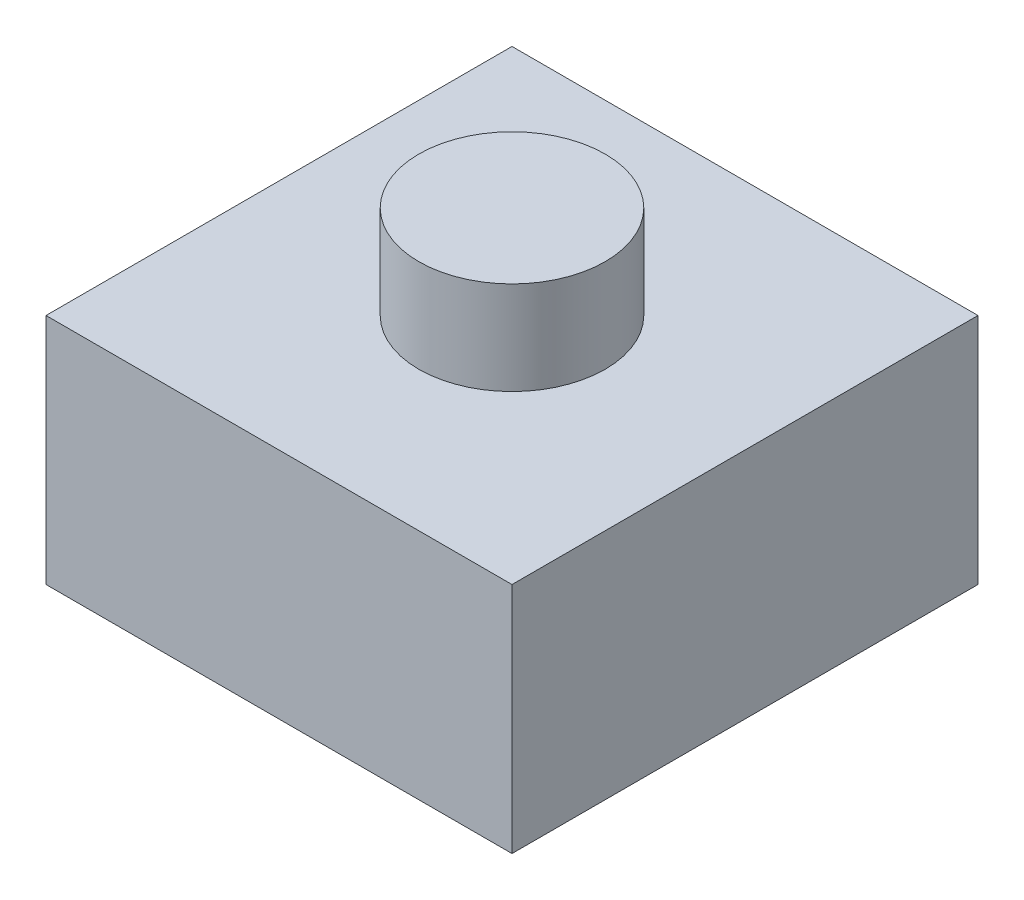
ISO-10303-21;
HEADER;
FILE_DESCRIPTION(('STEP AP214'),'2;1');
FILE_NAME('part.step','',(''),(''),'','','');
FILE_SCHEMA(('AUTOMOTIVE_DESIGN { 1 0 10303 214 1 1 1 1 }'));
ENDSEC;
DATA;
#1=APPLICATION_CONTEXT('core data for automotive mechanical design processes');
#2=APPLICATION_PROTOCOL_DEFINITION('international standard','automotive_design',2000,#1);
#3=PRODUCT_CONTEXT('',#1,'mechanical');
#4=PRODUCT('Part','Part','',(#3));
#5=PRODUCT_RELATED_PRODUCT_CATEGORY('part','',(#4));
#6=PRODUCT_DEFINITION_FORMATION('','',#4);
#7=PRODUCT_DEFINITION_CONTEXT('part definition',#1,'design');
#8=PRODUCT_DEFINITION('design','',#6,#7);
#9=PRODUCT_DEFINITION_SHAPE('','',#8);
#10=(LENGTH_UNIT() NAMED_UNIT(*) SI_UNIT(.MILLI.,.METRE.));
#11=(NAMED_UNIT(*) PLANE_ANGLE_UNIT() SI_UNIT($,.RADIAN.));
#12=(NAMED_UNIT(*) SI_UNIT($,.STERADIAN.) SOLID_ANGLE_UNIT());
#13=UNCERTAINTY_MEASURE_WITH_UNIT(LENGTH_MEASURE(1.E-05),#10,'distance_accuracy_value','');
#14=(GEOMETRIC_REPRESENTATION_CONTEXT(3) GLOBAL_UNCERTAINTY_ASSIGNED_CONTEXT((#13)) GLOBAL_UNIT_ASSIGNED_CONTEXT((#10,
#11,#12)) REPRESENTATION_CONTEXT('',''));
#15=CARTESIAN_POINT('',(0.,0.,0.));
#16=DIRECTION('',(0.,0.,1.));
#17=DIRECTION('',(1.,0.,0.));
#18=AXIS2_PLACEMENT_3D('',#15,#16,#17);
#19=CARTESIAN_POINT('',(-2.5,2.5,2.5));
#20=DIRECTION('',(1.,0.,0.));
#21=DIRECTION('',(0.,0.,-1.));
#22=AXIS2_PLACEMENT_3D('',#19,#20,#21);
#23=PLANE('',#22);
#24=DIRECTION('',(0.,0.,1.));
#25=VECTOR('',#24,1.);
#26=CARTESIAN_POINT('',(-2.5,0.,2.5));
#27=LINE('',#26,#25);
#28=CARTESIAN_POINT('',(-2.5,0.,-2.5));
#29=VERTEX_POINT('',#28);
#30=CARTESIAN_POINT('',(-2.5,0.,2.5));
#31=VERTEX_POINT('',#30);
#32=EDGE_CURVE('E99',#29,#31,#27,.T.);
#33=ORIENTED_EDGE('',*,*,#32,.T.);
#34=DIRECTION('',(0.,-1.,0.));
#35=VECTOR('',#34,1.);
#36=CARTESIAN_POINT('',(-2.5,2.5,2.5));
#37=LINE('',#36,#35);
#38=CARTESIAN_POINT('',(-2.5,2.5,2.5));
#39=VERTEX_POINT('',#38);
#40=EDGE_CURVE('E36',#39,#31,#37,.T.);
#41=ORIENTED_EDGE('',*,*,#40,.F.);
#42=DIRECTION('',(0.,0.,1.));
#43=VECTOR('',#42,1.);
#44=CARTESIAN_POINT('',(-2.5,2.5,2.5));
#45=LINE('',#44,#43);
#46=CARTESIAN_POINT('',(-2.5,2.5,-2.5));
#47=VERTEX_POINT('',#46);
#48=EDGE_CURVE('E86',#47,#39,#45,.T.);
#49=ORIENTED_EDGE('',*,*,#48,.F.);
#50=DIRECTION('',(0.,-1.,0.));
#51=VECTOR('',#50,1.);
#52=CARTESIAN_POINT('',(-2.5,2.5,-2.5));
#53=LINE('',#52,#51);
#54=EDGE_CURVE('E95',#47,#29,#53,.T.);
#55=ORIENTED_EDGE('',*,*,#54,.T.);
#56=EDGE_LOOP('',(#33,#41,#49,#55));
#57=FACE_BOUND('',#56,.T.);
#58=ADVANCED_FACE('F33',(#57),#23,.F.);
#59=CARTESIAN_POINT('',(2.5,2.5,2.5));
#60=DIRECTION('',(0.,0.,-1.));
#61=DIRECTION('',(-1.,0.,0.));
#62=AXIS2_PLACEMENT_3D('',#59,#60,#61);
#63=PLANE('',#62);
#64=DIRECTION('',(1.,0.,0.));
#65=VECTOR('',#64,1.);
#66=CARTESIAN_POINT('',(2.5,0.,2.5));
#67=LINE('',#66,#65);
#68=CARTESIAN_POINT('',(2.5,0.,2.5));
#69=VERTEX_POINT('',#68);
#70=EDGE_CURVE('E91',#31,#69,#67,.T.);
#71=ORIENTED_EDGE('',*,*,#70,.T.);
#72=DIRECTION('',(0.,-1.,0.));
#73=VECTOR('',#72,1.);
#74=CARTESIAN_POINT('',(2.5,2.5,2.5));
#75=LINE('',#74,#73);
#76=CARTESIAN_POINT('',(2.5,2.5,2.5));
#77=VERTEX_POINT('',#76);
#78=EDGE_CURVE('E89',#77,#69,#75,.T.);
#79=ORIENTED_EDGE('',*,*,#78,.F.);
#80=DIRECTION('',(1.,0.,0.));
#81=VECTOR('',#80,1.);
#82=CARTESIAN_POINT('',(2.5,2.5,2.5));
#83=LINE('',#82,#81);
#84=EDGE_CURVE('E81',#39,#77,#83,.T.);
#85=ORIENTED_EDGE('',*,*,#84,.F.);
#86=ORIENTED_EDGE('',*,*,#40,.T.);
#87=EDGE_LOOP('',(#71,#79,#85,#86));
#88=FACE_BOUND('',#87,.T.);
#89=ADVANCED_FACE('F90',(#88),#63,.F.);
#90=CARTESIAN_POINT('',(2.5,2.5,2.5));
#91=DIRECTION('',(-1.,0.,0.));
#92=DIRECTION('',(0.,0.,1.));
#93=AXIS2_PLACEMENT_3D('',#90,#91,#92);
#94=PLANE('',#93);
#95=DIRECTION('',(0.,0.,-1.));
#96=VECTOR('',#95,1.);
#97=CARTESIAN_POINT('',(2.5,0.,2.5));
#98=LINE('',#97,#96);
#99=CARTESIAN_POINT('',(2.5,0.,-2.5));
#100=VERTEX_POINT('',#99);
#101=EDGE_CURVE('E67',#69,#100,#98,.T.);
#102=ORIENTED_EDGE('',*,*,#101,.T.);
#103=DIRECTION('',(0.,-1.,0.));
#104=VECTOR('',#103,1.);
#105=CARTESIAN_POINT('',(2.5,2.5,-2.5));
#106=LINE('',#105,#104);
#107=CARTESIAN_POINT('',(2.5,2.5,-2.5));
#108=VERTEX_POINT('',#107);
#109=EDGE_CURVE('E92',#108,#100,#106,.T.);
#110=ORIENTED_EDGE('',*,*,#109,.F.);
#111=DIRECTION('',(0.,0.,-1.));
#112=VECTOR('',#111,1.);
#113=CARTESIAN_POINT('',(2.5,2.5,2.5));
#114=LINE('',#113,#112);
#115=EDGE_CURVE('E84',#77,#108,#114,.T.);
#116=ORIENTED_EDGE('',*,*,#115,.F.);
#117=ORIENTED_EDGE('',*,*,#78,.T.);
#118=EDGE_LOOP('',(#102,#110,#116,#117));
#119=FACE_BOUND('',#118,.T.);
#120=ADVANCED_FACE('F93',(#119),#94,.F.);
#121=CARTESIAN_POINT('',(2.5,2.5,-2.5));
#122=DIRECTION('',(0.,0.,1.));
#123=DIRECTION('',(1.,0.,0.));
#124=AXIS2_PLACEMENT_3D('',#121,#122,#123);
#125=PLANE('',#124);
#126=DIRECTION('',(-1.,0.,0.));
#127=VECTOR('',#126,1.);
#128=CARTESIAN_POINT('',(2.5,0.,-2.5));
#129=LINE('',#128,#127);
#130=EDGE_CURVE('E73',#100,#29,#129,.T.);
#131=ORIENTED_EDGE('',*,*,#130,.T.);
#132=ORIENTED_EDGE('',*,*,#54,.F.);
#133=DIRECTION('',(-1.,0.,0.));
#134=VECTOR('',#133,1.);
#135=CARTESIAN_POINT('',(2.5,2.5,-2.5));
#136=LINE('',#135,#134);
#137=EDGE_CURVE('E50',#108,#47,#136,.T.);
#138=ORIENTED_EDGE('',*,*,#137,.F.);
#139=ORIENTED_EDGE('',*,*,#109,.T.);
#140=EDGE_LOOP('',(#131,#132,#138,#139));
#141=FACE_BOUND('',#140,.T.);
#142=ADVANCED_FACE('F107',(#141),#125,.F.);
#143=CARTESIAN_POINT('',(0.,2.5,0.));
#144=DIRECTION('',(0.,1.,0.));
#145=DIRECTION('',(0.,0.,1.));
#146=AXIS2_PLACEMENT_3D('',#143,#144,#145);
#147=PLANE('',#146);
#148=CARTESIAN_POINT('',(0.,2.5,0.));
#149=DIRECTION('',(0.,1.,0.));
#150=DIRECTION('',(0.,0.,1.));
#151=AXIS2_PLACEMENT_3D('',#148,#149,#150);
#152=CIRCLE('',#151,1.);
#153=CARTESIAN_POINT('',(0.,2.5,1.));
#154=VERTEX_POINT('',#153);
#155=EDGE_CURVE('E11',#154,#154,#152,.T.);
#156=ORIENTED_EDGE('',*,*,#155,.F.);
#157=EDGE_LOOP('',(#156));
#158=FACE_BOUND('',#157,.T.);
#159=ORIENTED_EDGE('',*,*,#48,.T.);
#160=ORIENTED_EDGE('',*,*,#84,.T.);
#161=ORIENTED_EDGE('',*,*,#115,.T.);
#162=ORIENTED_EDGE('',*,*,#137,.T.);
#163=EDGE_LOOP('',(#159,#160,#161,#162));
#164=FACE_BOUND('',#163,.T.);
#165=ADVANCED_FACE('F82',(#158,#164),#147,.T.);
#166=CARTESIAN_POINT('',(0.,0.,0.));
#167=DIRECTION('',(0.,1.,0.));
#168=DIRECTION('',(0.,0.,1.));
#169=AXIS2_PLACEMENT_3D('',#166,#167,#168);
#170=PLANE('',#169);
#171=ORIENTED_EDGE('',*,*,#32,.F.);
#172=ORIENTED_EDGE('',*,*,#130,.F.);
#173=ORIENTED_EDGE('',*,*,#101,.F.);
#174=ORIENTED_EDGE('',*,*,#70,.F.);
#175=EDGE_LOOP('',(#171,#172,#173,#174));
#176=FACE_BOUND('',#175,.T.);
#177=ADVANCED_FACE('F110',(#176),#170,.F.);
#178=CARTESIAN_POINT('',(0.,3.5,0.));
#179=DIRECTION('',(0.,-1.,0.));
#180=DIRECTION('',(0.,0.,-1.));
#181=AXIS2_PLACEMENT_3D('',#178,#179,#180);
#182=CYLINDRICAL_SURFACE('',#181,1.);
#183=CARTESIAN_POINT('',(0.,3.5,0.));
#184=DIRECTION('',(0.,1.,0.));
#185=DIRECTION('',(0.,0.,1.));
#186=AXIS2_PLACEMENT_3D('',#183,#184,#185);
#187=CIRCLE('',#186,1.);
#188=CARTESIAN_POINT('',(0.,3.5,1.));
#189=VERTEX_POINT('',#188);
#190=EDGE_CURVE('E102',#189,#189,#187,.T.);
#191=ORIENTED_EDGE('',*,*,#190,.F.);
#192=EDGE_LOOP('',(#191));
#193=FACE_BOUND('',#192,.T.);
#194=ORIENTED_EDGE('',*,*,#155,.T.);
#195=EDGE_LOOP('',(#194));
#196=FACE_BOUND('',#195,.T.);
#197=ADVANCED_FACE('F118',(#193,#196),#182,.T.);
#198=CARTESIAN_POINT('',(0.,3.5,0.));
#199=DIRECTION('',(0.,1.,0.));
#200=DIRECTION('',(0.,0.,1.));
#201=AXIS2_PLACEMENT_3D('',#198,#199,#200);
#202=PLANE('',#201);
#203=ORIENTED_EDGE('',*,*,#190,.T.);
#204=EDGE_LOOP('',(#203));
#205=FACE_BOUND('',#204,.T.);
#206=ADVANCED_FACE('F116',(#205),#202,.T.);
#207=CLOSED_SHELL('',(#58,#89,#120,#142,#165,#177,#197,#206));
#208=MANIFOLD_SOLID_BREP('B2',#207);
#209=ADVANCED_BREP_SHAPE_REPRESENTATION('',(#18,#208),#14);
#210=SHAPE_DEFINITION_REPRESENTATION(#9,#209);
ENDSEC;
END-ISO-10303-21;
